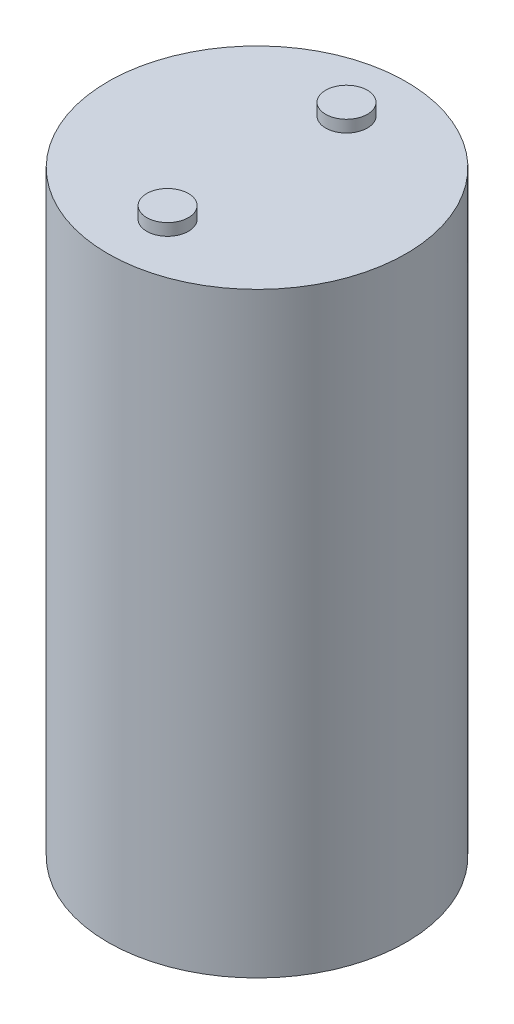
ISO-10303-21;
HEADER;
FILE_DESCRIPTION(('STEP AP214'),'2;1');
FILE_NAME('part.step','',(''),(''),'','','');
FILE_SCHEMA(('AUTOMOTIVE_DESIGN { 1 0 10303 214 1 1 1 1 }'));
ENDSEC;
DATA;
#1=APPLICATION_CONTEXT('core data for automotive mechanical design processes');
#2=APPLICATION_PROTOCOL_DEFINITION('international standard','automotive_design',2000,#1);
#3=PRODUCT_CONTEXT('',#1,'mechanical');
#4=PRODUCT('Part','Part','',(#3));
#5=PRODUCT_RELATED_PRODUCT_CATEGORY('part','',(#4));
#6=PRODUCT_DEFINITION_FORMATION('','',#4);
#7=PRODUCT_DEFINITION_CONTEXT('part definition',#1,'design');
#8=PRODUCT_DEFINITION('design','',#6,#7);
#9=PRODUCT_DEFINITION_SHAPE('','',#8);
#10=(LENGTH_UNIT() NAMED_UNIT(*) SI_UNIT(.MILLI.,.METRE.));
#11=(NAMED_UNIT(*) PLANE_ANGLE_UNIT() SI_UNIT($,.RADIAN.));
#12=(NAMED_UNIT(*) SI_UNIT($,.STERADIAN.) SOLID_ANGLE_UNIT());
#13=UNCERTAINTY_MEASURE_WITH_UNIT(LENGTH_MEASURE(1.E-05),#10,'distance_accuracy_value','');
#14=(GEOMETRIC_REPRESENTATION_CONTEXT(3) GLOBAL_UNCERTAINTY_ASSIGNED_CONTEXT((#13)) GLOBAL_UNIT_ASSIGNED_CONTEXT((#10,
#11,#12)) REPRESENTATION_CONTEXT('',''));
#15=CARTESIAN_POINT('',(0.,0.,0.));
#16=DIRECTION('',(0.,0.,1.));
#17=DIRECTION('',(1.,0.,0.));
#18=AXIS2_PLACEMENT_3D('',#15,#16,#17);
#19=CARTESIAN_POINT('',(0.,50.,0.));
#20=DIRECTION('',(0.,-1.,0.));
#21=DIRECTION('',(0.,0.,-1.));
#22=AXIS2_PLACEMENT_3D('',#19,#20,#21);
#23=CYLINDRICAL_SURFACE('',#22,12.5);
#24=CARTESIAN_POINT('',(0.,50.,0.));
#25=DIRECTION('',(0.,1.,0.));
#26=DIRECTION('',(0.,0.,1.));
#27=AXIS2_PLACEMENT_3D('',#24,#25,#26);
#28=CIRCLE('',#27,12.5);
#29=CARTESIAN_POINT('',(0.,50.,12.5));
#30=VERTEX_POINT('',#29);
#31=EDGE_CURVE('E10',#30,#30,#28,.T.);
#32=ORIENTED_EDGE('',*,*,#31,.F.);
#33=EDGE_LOOP('',(#32));
#34=FACE_BOUND('',#33,.T.);
#35=CARTESIAN_POINT('',(0.,0.,0.));
#36=DIRECTION('',(0.,1.,0.));
#37=DIRECTION('',(0.,0.,1.));
#38=AXIS2_PLACEMENT_3D('',#35,#36,#37);
#39=CIRCLE('',#38,12.5);
#40=CARTESIAN_POINT('',(0.,0.,12.5));
#41=VERTEX_POINT('',#40);
#42=EDGE_CURVE('E48',#41,#41,#39,.T.);
#43=ORIENTED_EDGE('',*,*,#42,.T.);
#44=EDGE_LOOP('',(#43));
#45=FACE_BOUND('',#44,.T.);
#46=ADVANCED_FACE('F45',(#34,#45),#23,.T.);
#47=CARTESIAN_POINT('',(0.,50.,0.));
#48=DIRECTION('',(0.,1.,0.));
#49=DIRECTION('',(0.,0.,1.));
#50=AXIS2_PLACEMENT_3D('',#47,#48,#49);
#51=PLANE('',#50);
#52=CARTESIAN_POINT('',(0.,50.,7.5));
#53=DIRECTION('',(0.,1.,0.));
#54=DIRECTION('',(0.,0.,1.));
#55=AXIS2_PLACEMENT_3D('',#52,#53,#54);
#56=CIRCLE('',#55,1.75);
#57=CARTESIAN_POINT('',(0.,50.,9.25));
#58=VERTEX_POINT('',#57);
#59=EDGE_CURVE('E63',#58,#58,#56,.T.);
#60=ORIENTED_EDGE('',*,*,#59,.F.);
#61=EDGE_LOOP('',(#60));
#62=FACE_BOUND('',#61,.T.);
#63=CARTESIAN_POINT('',(0.,50.,-7.5));
#64=DIRECTION('',(0.,1.,0.));
#65=DIRECTION('',(0.,0.,1.));
#66=AXIS2_PLACEMENT_3D('',#63,#64,#65);
#67=CIRCLE('',#66,1.75);
#68=CARTESIAN_POINT('',(0.,50.,-5.75));
#69=VERTEX_POINT('',#68);
#70=EDGE_CURVE('E57',#69,#69,#67,.T.);
#71=ORIENTED_EDGE('',*,*,#70,.F.);
#72=EDGE_LOOP('',(#71));
#73=FACE_BOUND('',#72,.T.);
#74=ORIENTED_EDGE('',*,*,#31,.T.);
#75=EDGE_LOOP('',(#74));
#76=FACE_BOUND('',#75,.T.);
#77=ADVANCED_FACE('F78',(#62,#73,#76),#51,.T.);
#78=CARTESIAN_POINT('',(0.,0.,0.));
#79=DIRECTION('',(0.,1.,0.));
#80=DIRECTION('',(0.,0.,1.));
#81=AXIS2_PLACEMENT_3D('',#78,#79,#80);
#82=PLANE('',#81);
#83=ORIENTED_EDGE('',*,*,#42,.F.);
#84=EDGE_LOOP('',(#83));
#85=FACE_BOUND('',#84,.T.);
#86=ADVANCED_FACE('F81',(#85),#82,.F.);
#87=CARTESIAN_POINT('',(0.,51.,-7.5));
#88=DIRECTION('',(0.,-1.,0.));
#89=DIRECTION('',(0.,0.,-1.));
#90=AXIS2_PLACEMENT_3D('',#87,#88,#89);
#91=CYLINDRICAL_SURFACE('',#90,1.75);
#92=CARTESIAN_POINT('',(0.,51.,-7.5));
#93=DIRECTION('',(0.,1.,0.));
#94=DIRECTION('',(0.,0.,1.));
#95=AXIS2_PLACEMENT_3D('',#92,#93,#94);
#96=CIRCLE('',#95,1.75);
#97=CARTESIAN_POINT('',(0.,51.,-5.75));
#98=VERTEX_POINT('',#97);
#99=EDGE_CURVE('E55',#98,#98,#96,.T.);
#100=ORIENTED_EDGE('',*,*,#99,.F.);
#101=EDGE_LOOP('',(#100));
#102=FACE_BOUND('',#101,.T.);
#103=ORIENTED_EDGE('',*,*,#70,.T.);
#104=EDGE_LOOP('',(#103));
#105=FACE_BOUND('',#104,.T.);
#106=ADVANCED_FACE('F85',(#102,#105),#91,.T.);
#107=CARTESIAN_POINT('',(0.,51.,0.));
#108=DIRECTION('',(0.,1.,0.));
#109=DIRECTION('',(0.,0.,1.));
#110=AXIS2_PLACEMENT_3D('',#107,#108,#109);
#111=PLANE('',#110);
#112=ORIENTED_EDGE('',*,*,#99,.T.);
#113=EDGE_LOOP('',(#112));
#114=FACE_BOUND('',#113,.T.);
#115=ADVANCED_FACE('F74',(#114),#111,.T.);
#116=CARTESIAN_POINT('',(0.,51.,7.5));
#117=DIRECTION('',(0.,-1.,0.));
#118=DIRECTION('',(0.,0.,-1.));
#119=AXIS2_PLACEMENT_3D('',#116,#117,#118);
#120=CYLINDRICAL_SURFACE('',#119,1.75);
#121=CARTESIAN_POINT('',(0.,51.,7.5));
#122=DIRECTION('',(0.,1.,0.));
#123=DIRECTION('',(0.,0.,1.));
#124=AXIS2_PLACEMENT_3D('',#121,#122,#123);
#125=CIRCLE('',#124,1.75);
#126=CARTESIAN_POINT('',(0.,51.,9.25));
#127=VERTEX_POINT('',#126);
#128=EDGE_CURVE('E60',#127,#127,#125,.T.);
#129=ORIENTED_EDGE('',*,*,#128,.F.);
#130=EDGE_LOOP('',(#129));
#131=FACE_BOUND('',#130,.T.);
#132=ORIENTED_EDGE('',*,*,#59,.T.);
#133=EDGE_LOOP('',(#132));
#134=FACE_BOUND('',#133,.T.);
#135=ADVANCED_FACE('F71',(#131,#134),#120,.T.);
#136=CARTESIAN_POINT('',(0.,51.,0.));
#137=DIRECTION('',(0.,1.,0.));
#138=DIRECTION('',(0.,0.,1.));
#139=AXIS2_PLACEMENT_3D('',#136,#137,#138);
#140=PLANE('',#139);
#141=ORIENTED_EDGE('',*,*,#128,.T.);
#142=EDGE_LOOP('',(#141));
#143=FACE_BOUND('',#142,.T.);
#144=ADVANCED_FACE('F69',(#143),#140,.T.);
#145=CLOSED_SHELL('',(#46,#77,#86,#106,#115,#135,#144));
#146=MANIFOLD_SOLID_BREP('B2',#145);
#147=ADVANCED_BREP_SHAPE_REPRESENTATION('',(#18,#146),#14);
#148=SHAPE_DEFINITION_REPRESENTATION(#9,#147);
ENDSEC;
END-ISO-10303-21;
